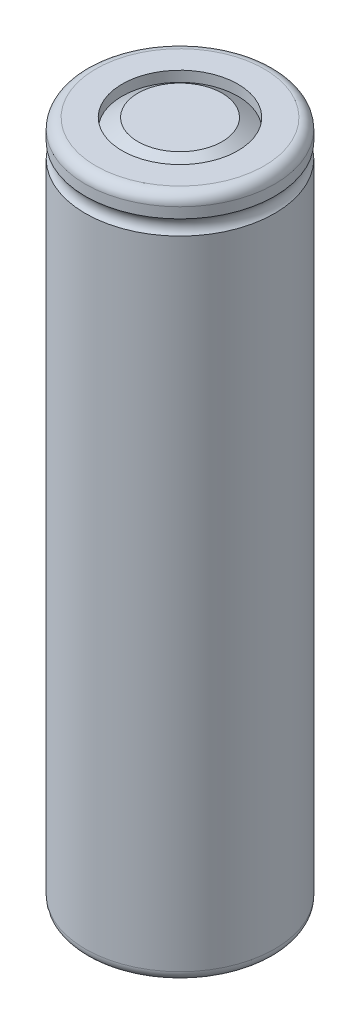
ISO-10303-21;
HEADER;
FILE_DESCRIPTION(('STEP AP214'),'2;1');
FILE_NAME('part.step','',(''),(''),'','','');
FILE_SCHEMA(('AUTOMOTIVE_DESIGN { 1 0 10303 214 1 1 1 1 }'));
ENDSEC;
DATA;
#1=APPLICATION_CONTEXT('core data for automotive mechanical design processes');
#2=APPLICATION_PROTOCOL_DEFINITION('international standard','automotive_design',2000,#1);
#3=PRODUCT_CONTEXT('',#1,'mechanical');
#4=PRODUCT('Part','Part','',(#3));
#5=PRODUCT_RELATED_PRODUCT_CATEGORY('part','',(#4));
#6=PRODUCT_DEFINITION_FORMATION('','',#4);
#7=PRODUCT_DEFINITION_CONTEXT('part definition',#1,'design');
#8=PRODUCT_DEFINITION('design','',#6,#7);
#9=PRODUCT_DEFINITION_SHAPE('','',#8);
#10=(LENGTH_UNIT() NAMED_UNIT(*) SI_UNIT(.MILLI.,.METRE.));
#11=(NAMED_UNIT(*) PLANE_ANGLE_UNIT() SI_UNIT($,.RADIAN.));
#12=(NAMED_UNIT(*) SI_UNIT($,.STERADIAN.) SOLID_ANGLE_UNIT());
#13=UNCERTAINTY_MEASURE_WITH_UNIT(LENGTH_MEASURE(1.E-05),#10,'distance_accuracy_value','');
#14=(GEOMETRIC_REPRESENTATION_CONTEXT(3) GLOBAL_UNCERTAINTY_ASSIGNED_CONTEXT((#13)) GLOBAL_UNIT_ASSIGNED_CONTEXT((#10,
#11,#12)) REPRESENTATION_CONTEXT('',''));
#15=CARTESIAN_POINT('',(0.,0.,0.));
#16=DIRECTION('',(0.,0.,1.));
#17=DIRECTION('',(1.,0.,0.));
#18=AXIS2_PLACEMENT_3D('',#15,#16,#17);
#19=CARTESIAN_POINT('',(0.,0.,0.));
#20=DIRECTION('',(0.,-1.,0.));
#21=DIRECTION('',(0.,0.,-1.));
#22=AXIS2_PLACEMENT_3D('',#19,#20,#21);
#23=PLANE('',#22);
#24=CARTESIAN_POINT('',(0.,0.,0.));
#25=DIRECTION('',(0.,-1.,0.));
#26=DIRECTION('',(0.,0.,-1.));
#27=AXIS2_PLACEMENT_3D('',#24,#25,#26);
#28=CIRCLE('',#27,8.);
#29=CARTESIAN_POINT('',(0.,0.,-8.));
#30=VERTEX_POINT('',#29);
#31=EDGE_CURVE('E61',#30,#30,#28,.T.);
#32=ORIENTED_EDGE('',*,*,#31,.T.);
#33=EDGE_LOOP('',(#32));
#34=FACE_BOUND('',#33,.T.);
#35=ADVANCED_FACE('F43',(#34),#23,.T.);
#36=CARTESIAN_POINT('',(0.,0.,0.));
#37=DIRECTION('',(0.,-1.,0.));
#38=DIRECTION('',(0.,0.,-1.));
#39=AXIS2_PLACEMENT_3D('',#36,#37,#38);
#40=CYLINDRICAL_SURFACE('',#39,9.);
#41=CARTESIAN_POINT('',(0.,1.,0.));
#42=DIRECTION('',(0.,-1.,0.));
#43=DIRECTION('',(0.,0.,-1.));
#44=AXIS2_PLACEMENT_3D('',#41,#42,#43);
#45=CIRCLE('',#44,9.);
#46=CARTESIAN_POINT('',(0.,1.,-9.));
#47=VERTEX_POINT('',#46);
#48=EDGE_CURVE('E56',#47,#47,#45,.F.);
#49=ORIENTED_EDGE('',*,*,#48,.T.);
#50=EDGE_LOOP('',(#49));
#51=FACE_BOUND('',#50,.T.);
#52=CARTESIAN_POINT('',(0.,61.5857864376269,0.));
#53=DIRECTION('',(0.,-1.,0.));
#54=DIRECTION('',(0.,0.,-1.));
#55=AXIS2_PLACEMENT_3D('',#52,#53,#54);
#56=CIRCLE('',#55,9.);
#57=CARTESIAN_POINT('',(0.,61.5857864376269,-9.));
#58=VERTEX_POINT('',#57);
#59=EDGE_CURVE('E67',#58,#58,#56,.T.);
#60=ORIENTED_EDGE('',*,*,#59,.T.);
#61=EDGE_LOOP('',(#60));
#62=FACE_BOUND('',#61,.T.);
#63=ADVANCED_FACE('F103',(#51,#62),#40,.T.);
#64=CARTESIAN_POINT('',(0.,62.2928932188135,0.));
#65=DIRECTION('',(0.,-1.,0.));
#66=DIRECTION('',(0.,0.,-1.));
#67=AXIS2_PLACEMENT_3D('',#64,#65,#66);
#68=TOROIDAL_SURFACE('',#67,9.70710678118655,0.999999999999998);
#69=CARTESIAN_POINT('',(0.,63.,0.));
#70=DIRECTION('',(0.,-1.,0.));
#71=DIRECTION('',(0.,0.,-1.));
#72=AXIS2_PLACEMENT_3D('',#69,#70,#71);
#73=CIRCLE('',#72,9.);
#74=CARTESIAN_POINT('',(0.,63.,-9.));
#75=VERTEX_POINT('',#74);
#76=EDGE_CURVE('E71',#75,#75,#73,.T.);
#77=ORIENTED_EDGE('',*,*,#76,.T.);
#78=EDGE_LOOP('',(#77));
#79=FACE_BOUND('',#78,.T.);
#80=ORIENTED_EDGE('',*,*,#59,.F.);
#81=EDGE_LOOP('',(#80));
#82=FACE_BOUND('',#81,.T.);
#83=ADVANCED_FACE('F109',(#79,#82),#68,.F.);
#84=CARTESIAN_POINT('',(0.,0.,0.));
#85=DIRECTION('',(0.,-1.,0.));
#86=DIRECTION('',(0.,0.,-1.));
#87=AXIS2_PLACEMENT_3D('',#84,#85,#86);
#88=CYLINDRICAL_SURFACE('',#87,9.);
#89=CARTESIAN_POINT('',(0.,64.,0.));
#90=DIRECTION('',(0.,1.,0.));
#91=DIRECTION('',(0.,0.,1.));
#92=AXIS2_PLACEMENT_3D('',#89,#90,#91);
#93=CIRCLE('',#92,9.);
#94=CARTESIAN_POINT('',(0.,64.,9.));
#95=VERTEX_POINT('',#94);
#96=EDGE_CURVE('E51',#95,#95,#93,.F.);
#97=ORIENTED_EDGE('',*,*,#96,.T.);
#98=EDGE_LOOP('',(#97));
#99=FACE_BOUND('',#98,.T.);
#100=ORIENTED_EDGE('',*,*,#76,.F.);
#101=EDGE_LOOP('',(#100));
#102=FACE_BOUND('',#101,.T.);
#103=ADVANCED_FACE('F115',(#99,#102),#88,.T.);
#104=CARTESIAN_POINT('',(9.,65.,0.));
#105=DIRECTION('',(0.,1.,0.));
#106=DIRECTION('',(0.,0.,1.));
#107=AXIS2_PLACEMENT_3D('',#104,#105,#106);
#108=PLANE('',#107);
#109=CARTESIAN_POINT('',(0.,65.,0.));
#110=DIRECTION('',(0.,1.,0.));
#111=DIRECTION('',(0.,0.,1.));
#112=AXIS2_PLACEMENT_3D('',#109,#110,#111);
#113=CIRCLE('',#112,8.);
#114=CARTESIAN_POINT('',(0.,65.,8.));
#115=VERTEX_POINT('',#114);
#116=EDGE_CURVE('E10',#115,#115,#113,.T.);
#117=ORIENTED_EDGE('',*,*,#116,.T.);
#118=EDGE_LOOP('',(#117));
#119=FACE_BOUND('',#118,.T.);
#120=CARTESIAN_POINT('',(0.,65.,0.));
#121=DIRECTION('',(0.,-1.,0.));
#122=DIRECTION('',(0.,0.,-1.));
#123=AXIS2_PLACEMENT_3D('',#120,#121,#122);
#124=CIRCLE('',#123,5.5);
#125=CARTESIAN_POINT('',(0.,65.,-5.5));
#126=VERTEX_POINT('',#125);
#127=EDGE_CURVE('E75',#126,#126,#124,.T.);
#128=ORIENTED_EDGE('',*,*,#127,.T.);
#129=EDGE_LOOP('',(#128));
#130=FACE_BOUND('',#129,.T.);
#131=ADVANCED_FACE('F119',(#119,#130),#108,.T.);
#132=CARTESIAN_POINT('',(0.,0.,0.));
#133=DIRECTION('',(0.,-1.,0.));
#134=DIRECTION('',(0.,0.,-1.));
#135=AXIS2_PLACEMENT_3D('',#132,#133,#134);
#136=CYLINDRICAL_SURFACE('',#135,5.5);
#137=CARTESIAN_POINT('',(0.,64.,0.));
#138=DIRECTION('',(0.,-1.,0.));
#139=DIRECTION('',(0.,0.,-1.));
#140=AXIS2_PLACEMENT_3D('',#137,#138,#139);
#141=CIRCLE('',#140,5.5);
#142=CARTESIAN_POINT('',(0.,64.,-5.5));
#143=VERTEX_POINT('',#142);
#144=EDGE_CURVE('E79',#143,#143,#141,.T.);
#145=ORIENTED_EDGE('',*,*,#144,.T.);
#146=EDGE_LOOP('',(#145));
#147=FACE_BOUND('',#146,.T.);
#148=ORIENTED_EDGE('',*,*,#127,.F.);
#149=EDGE_LOOP('',(#148));
#150=FACE_BOUND('',#149,.T.);
#151=ADVANCED_FACE('F101',(#147,#150),#136,.F.);
#152=CARTESIAN_POINT('',(0.,64.,0.));
#153=DIRECTION('',(0.,-1.,0.));
#154=DIRECTION('',(0.,0.,-1.));
#155=AXIS2_PLACEMENT_3D('',#152,#153,#154);
#156=CONICAL_SURFACE('',#155,5.5,0.98279372324733);
#157=CARTESIAN_POINT('',(0.,65.,0.));
#158=DIRECTION('',(0.,-1.,0.));
#159=DIRECTION('',(0.,0.,-1.));
#160=AXIS2_PLACEMENT_3D('',#157,#158,#159);
#161=CIRCLE('',#160,4.);
#162=CARTESIAN_POINT('',(0.,65.,-4.));
#163=VERTEX_POINT('',#162);
#164=EDGE_CURVE('E83',#163,#163,#161,.T.);
#165=ORIENTED_EDGE('',*,*,#164,.T.);
#166=EDGE_LOOP('',(#165));
#167=FACE_BOUND('',#166,.T.);
#168=ORIENTED_EDGE('',*,*,#144,.F.);
#169=EDGE_LOOP('',(#168));
#170=FACE_BOUND('',#169,.T.);
#171=ADVANCED_FACE('F88',(#167,#170),#156,.T.);
#172=CARTESIAN_POINT('',(4.,65.,0.));
#173=DIRECTION('',(0.,1.,0.));
#174=DIRECTION('',(0.,0.,1.));
#175=AXIS2_PLACEMENT_3D('',#172,#173,#174);
#176=PLANE('',#175);
#177=ORIENTED_EDGE('',*,*,#164,.F.);
#178=EDGE_LOOP('',(#177));
#179=FACE_BOUND('',#178,.T.);
#180=ADVANCED_FACE('F91',(#179),#176,.T.);
#181=CARTESIAN_POINT('',(0.,1.,0.));
#182=DIRECTION('',(0.,-1.,0.));
#183=DIRECTION('',(0.,0.,-1.));
#184=AXIS2_PLACEMENT_3D('',#181,#182,#183);
#185=TOROIDAL_SURFACE('',#184,8.,1.);
#186=ORIENTED_EDGE('',*,*,#48,.F.);
#187=EDGE_LOOP('',(#186));
#188=FACE_BOUND('',#187,.T.);
#189=ORIENTED_EDGE('',*,*,#31,.F.);
#190=EDGE_LOOP('',(#189));
#191=FACE_BOUND('',#190,.T.);
#192=ADVANCED_FACE('F93',(#188,#191),#185,.T.);
#193=CARTESIAN_POINT('',(0.,64.,0.));
#194=DIRECTION('',(0.,1.,0.));
#195=DIRECTION('',(0.,0.,1.));
#196=AXIS2_PLACEMENT_3D('',#193,#194,#195);
#197=TOROIDAL_SURFACE('',#196,8.,1.);
#198=ORIENTED_EDGE('',*,*,#116,.F.);
#199=EDGE_LOOP('',(#198));
#200=FACE_BOUND('',#199,.T.);
#201=ORIENTED_EDGE('',*,*,#96,.F.);
#202=EDGE_LOOP('',(#201));
#203=FACE_BOUND('',#202,.T.);
#204=ADVANCED_FACE('F45',(#200,#203),#197,.T.);
#205=CLOSED_SHELL('',(#35,#63,#83,#103,#131,#151,#171,#180,#192,#204));
#206=MANIFOLD_SOLID_BREP('B2',#205);
#207=ADVANCED_BREP_SHAPE_REPRESENTATION('',(#18,#206),#14);
#208=SHAPE_DEFINITION_REPRESENTATION(#9,#207);
ENDSEC;
END-ISO-10303-21;
